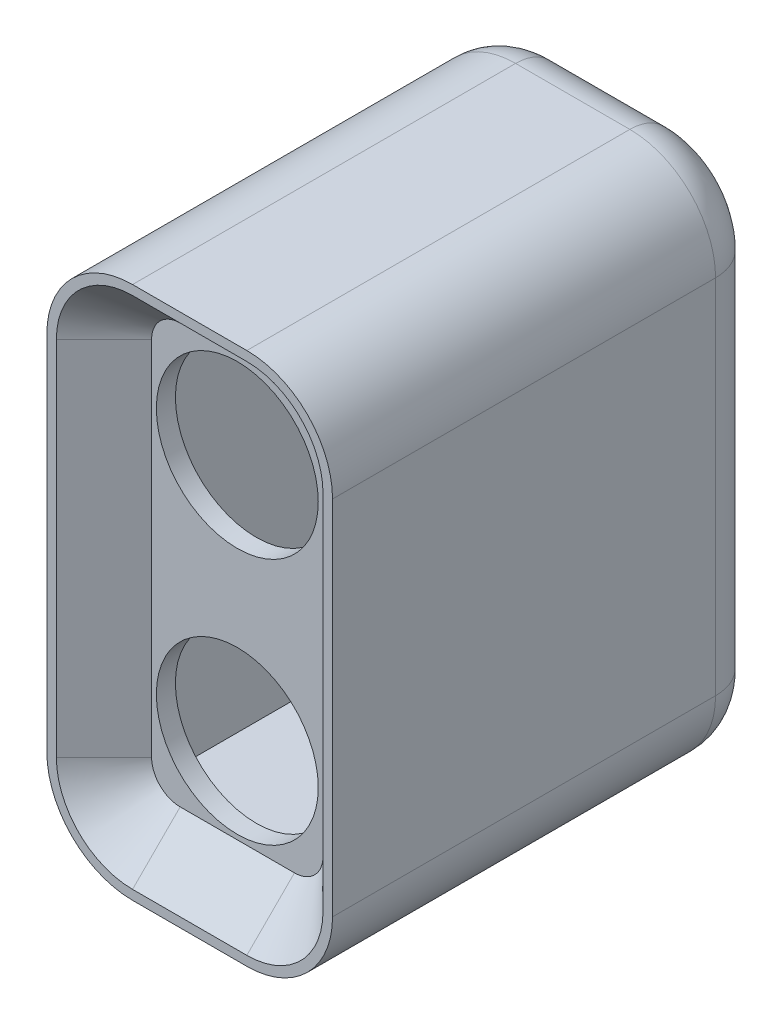
ISO-10303-21;
HEADER;
FILE_DESCRIPTION(('STEP AP214'),'2;1');
FILE_NAME('part.step','',(''),(''),'','','');
FILE_SCHEMA(('AUTOMOTIVE_DESIGN { 1 0 10303 214 1 1 1 1 }'));
ENDSEC;
DATA;
#1=APPLICATION_CONTEXT('core data for automotive mechanical design processes');
#2=APPLICATION_PROTOCOL_DEFINITION('international standard','automotive_design',2000,#1);
#3=PRODUCT_CONTEXT('',#1,'mechanical');
#4=PRODUCT('Part','Part','',(#3));
#5=PRODUCT_RELATED_PRODUCT_CATEGORY('part','',(#4));
#6=PRODUCT_DEFINITION_FORMATION('','',#4);
#7=PRODUCT_DEFINITION_CONTEXT('part definition',#1,'design');
#8=PRODUCT_DEFINITION('design','',#6,#7);
#9=PRODUCT_DEFINITION_SHAPE('','',#8);
#10=(LENGTH_UNIT() NAMED_UNIT(*) SI_UNIT(.MILLI.,.METRE.));
#11=(NAMED_UNIT(*) PLANE_ANGLE_UNIT() SI_UNIT($,.RADIAN.));
#12=(NAMED_UNIT(*) SI_UNIT($,.STERADIAN.) SOLID_ANGLE_UNIT());
#13=UNCERTAINTY_MEASURE_WITH_UNIT(LENGTH_MEASURE(1.E-05),#10,'distance_accuracy_value','');
#14=(GEOMETRIC_REPRESENTATION_CONTEXT(3) GLOBAL_UNCERTAINTY_ASSIGNED_CONTEXT((#13)) GLOBAL_UNIT_ASSIGNED_CONTEXT((#10,
#11,#12)) REPRESENTATION_CONTEXT('',''));
#15=CARTESIAN_POINT('',(0.,0.,0.));
#16=DIRECTION('',(0.,0.,1.));
#17=DIRECTION('',(1.,0.,0.));
#18=AXIS2_PLACEMENT_3D('',#15,#16,#17);
#19=CARTESIAN_POINT('',(12.0414393399998,-9.43999957830333,-103.748520193534));
#20=DIRECTION('',(0.,1.,0.));
#21=DIRECTION('',(-1.,0.,0.));
#22=AXIS2_PLACEMENT_3D('',#19,#20,#21);
#23=PLANE('',#22);
#24=DIRECTION('',(0.,0.,1.));
#25=VECTOR('',#24,1.);
#26=CARTESIAN_POINT('',(12.0414393399998,-9.43999957830333,-103.748520193534));
#27=LINE('',#26,#25);
#28=CARTESIAN_POINT('',(12.0414393399998,-9.43999957830333,-37.61899949646));
#29=VERTEX_POINT('',#28);
#30=CARTESIAN_POINT('',(12.0414393399998,-9.43999957830333,-2.));
#31=VERTEX_POINT('',#30);
#32=EDGE_CURVE('E291',#29,#31,#27,.T.);
#33=ORIENTED_EDGE('',*,*,#32,.F.);
#34=DIRECTION('',(-1.,0.,0.));
#35=VECTOR('',#34,1.);
#36=CARTESIAN_POINT('',(12.0414393399998,-9.43999957830333,-37.61899949646));
#37=LINE('',#36,#35);
#38=CARTESIAN_POINT('',(-10.35,-9.43999957830332,-37.61899949646));
#39=VERTEX_POINT('',#38);
#40=EDGE_CURVE('E274',#29,#39,#37,.T.);
#41=ORIENTED_EDGE('',*,*,#40,.T.);
#42=DIRECTION('',(0.,0.,1.));
#43=VECTOR('',#42,1.);
#44=CARTESIAN_POINT('',(-10.35,-9.43999957830332,-103.748520193534));
#45=LINE('',#44,#43);
#46=CARTESIAN_POINT('',(-10.35,-9.43999957830333,-2.));
#47=VERTEX_POINT('',#46);
#48=EDGE_CURVE('E289',#39,#47,#45,.T.);
#49=ORIENTED_EDGE('',*,*,#48,.T.);
#50=DIRECTION('',(-1.,0.,0.));
#51=VECTOR('',#50,1.);
#52=CARTESIAN_POINT('',(12.0414393399998,-9.43999957830333,-2.));
#53=LINE('',#52,#51);
#54=EDGE_CURVE('E286',#31,#47,#53,.T.);
#55=ORIENTED_EDGE('',*,*,#54,.F.);
#56=EDGE_LOOP('',(#33,#41,#49,#55));
#57=FACE_BOUND('',#56,.T.);
#58=ADVANCED_FACE('F39',(#57),#23,.T.);
#59=CARTESIAN_POINT('',(12.0414393399998,35.76,-103.748520193534));
#60=DIRECTION('',(-1.,0.,0.));
#61=DIRECTION('',(0.,0.,1.));
#62=AXIS2_PLACEMENT_3D('',#59,#60,#61);
#63=PLANE('',#62);
#64=DIRECTION('',(0.,0.,1.));
#65=VECTOR('',#64,1.);
#66=CARTESIAN_POINT('',(12.0414393399998,35.76,-103.748520193534));
#67=LINE('',#66,#65);
#68=CARTESIAN_POINT('',(12.0414393399998,35.76,-37.61899949646));
#69=VERTEX_POINT('',#68);
#70=CARTESIAN_POINT('',(12.0414393399998,35.76,-2.));
#71=VERTEX_POINT('',#70);
#72=EDGE_CURVE('E293',#69,#71,#67,.T.);
#73=ORIENTED_EDGE('',*,*,#72,.F.);
#74=DIRECTION('',(0.,-1.,0.));
#75=VECTOR('',#74,1.);
#76=CARTESIAN_POINT('',(12.0414393399998,35.76,-37.61899949646));
#77=LINE('',#76,#75);
#78=EDGE_CURVE('E271',#69,#29,#77,.T.);
#79=ORIENTED_EDGE('',*,*,#78,.T.);
#80=ORIENTED_EDGE('',*,*,#32,.T.);
#81=DIRECTION('',(0.,-1.,0.));
#82=VECTOR('',#81,1.);
#83=CARTESIAN_POINT('',(12.0414393399998,35.76,-2.));
#84=LINE('',#83,#82);
#85=EDGE_CURVE('E283',#71,#31,#84,.T.);
#86=ORIENTED_EDGE('',*,*,#85,.F.);
#87=EDGE_LOOP('',(#73,#79,#80,#86));
#88=FACE_BOUND('',#87,.T.);
#89=ADVANCED_FACE('F528',(#88),#63,.T.);
#90=CARTESIAN_POINT('',(12.0414393399998,35.76,-103.748520193534));
#91=DIRECTION('',(0.,-1.,0.));
#92=DIRECTION('',(1.,0.,0.));
#93=AXIS2_PLACEMENT_3D('',#90,#91,#92);
#94=PLANE('',#93);
#95=DIRECTION('',(0.,0.,1.));
#96=VECTOR('',#95,1.);
#97=CARTESIAN_POINT('',(-10.35,35.76,-103.748520193534));
#98=LINE('',#97,#96);
#99=CARTESIAN_POINT('',(-10.35,35.76,-37.61899949646));
#100=VERTEX_POINT('',#99);
#101=CARTESIAN_POINT('',(-10.35,35.76,-2.));
#102=VERTEX_POINT('',#101);
#103=EDGE_CURVE('E295',#100,#102,#98,.T.);
#104=ORIENTED_EDGE('',*,*,#103,.F.);
#105=DIRECTION('',(1.,0.,0.));
#106=VECTOR('',#105,1.);
#107=CARTESIAN_POINT('',(12.0414393399998,35.76,-37.61899949646));
#108=LINE('',#107,#106);
#109=EDGE_CURVE('E265',#100,#69,#108,.T.);
#110=ORIENTED_EDGE('',*,*,#109,.T.);
#111=ORIENTED_EDGE('',*,*,#72,.T.);
#112=DIRECTION('',(1.,0.,0.));
#113=VECTOR('',#112,1.);
#114=CARTESIAN_POINT('',(12.0414393399998,35.76,-2.));
#115=LINE('',#114,#113);
#116=EDGE_CURVE('E280',#102,#71,#115,.T.);
#117=ORIENTED_EDGE('',*,*,#116,.F.);
#118=EDGE_LOOP('',(#104,#110,#111,#117));
#119=FACE_BOUND('',#118,.T.);
#120=ADVANCED_FACE('F534',(#119),#94,.T.);
#121=CARTESIAN_POINT('',(-10.35,35.76,-103.748520193534));
#122=DIRECTION('',(1.,0.,0.));
#123=DIRECTION('',(0.,0.,-1.));
#124=AXIS2_PLACEMENT_3D('',#121,#122,#123);
#125=PLANE('',#124);
#126=ORIENTED_EDGE('',*,*,#48,.F.);
#127=DIRECTION('',(0.,1.,0.));
#128=VECTOR('',#127,1.);
#129=CARTESIAN_POINT('',(-10.35,35.76,-37.61899949646));
#130=LINE('',#129,#128);
#131=EDGE_CURVE('E384',#39,#100,#130,.T.);
#132=ORIENTED_EDGE('',*,*,#131,.T.);
#133=ORIENTED_EDGE('',*,*,#103,.T.);
#134=DIRECTION('',(0.,1.,0.));
#135=VECTOR('',#134,1.);
#136=CARTESIAN_POINT('',(-10.35,35.76,-2.));
#137=LINE('',#136,#135);
#138=EDGE_CURVE('E277',#47,#102,#137,.T.);
#139=ORIENTED_EDGE('',*,*,#138,.F.);
#140=EDGE_LOOP('',(#126,#132,#133,#139));
#141=FACE_BOUND('',#140,.T.);
#142=ADVANCED_FACE('F543',(#141),#125,.T.);
#143=CARTESIAN_POINT('',(0.,0.,0.));
#144=DIRECTION('',(0.,0.,1.));
#145=DIRECTION('',(1.,0.,0.));
#146=AXIS2_PLACEMENT_3D('',#143,#144,#145);
#147=PLANE('',#146);
#148=CARTESIAN_POINT('',(1.27555911146049E-06,0.160000210848315,0.));
#149=DIRECTION('',(0.,0.,1.));
#150=DIRECTION('',(1.,0.,0.));
#151=AXIS2_PLACEMENT_3D('',#148,#149,#150);
#152=CIRCLE('',#151,8.5);
#153=CARTESIAN_POINT('',(8.50000127555911,0.160000210848315,0.));
#154=VERTEX_POINT('',#153);
#155=EDGE_CURVE('E324',#154,#154,#152,.T.);
#156=ORIENTED_EDGE('',*,*,#155,.F.);
#157=EDGE_LOOP('',(#156));
#158=FACE_BOUND('',#157,.T.);
#159=CARTESIAN_POINT('',(1.27555911146049E-06,26.1600002108483,0.));
#160=DIRECTION('',(0.,0.,1.));
#161=DIRECTION('',(1.,0.,0.));
#162=AXIS2_PLACEMENT_3D('',#159,#160,#161);
#163=CIRCLE('',#162,8.5);
#164=CARTESIAN_POINT('',(8.50000127555911,26.1600002108483,0.));
#165=VERTEX_POINT('',#164);
#166=EDGE_CURVE('E319',#165,#165,#163,.T.);
#167=ORIENTED_EDGE('',*,*,#166,.F.);
#168=EDGE_LOOP('',(#167));
#169=FACE_BOUND('',#168,.T.);
#170=DIRECTION('',(0.,1.,0.));
#171=VECTOR('',#170,1.);
#172=CARTESIAN_POINT('',(9.00000127555903,-8.83999978915169,0.));
#173=LINE('',#172,#171);
#174=CARTESIAN_POINT('',(9.00000127555903,-5.83999978915169,0.));
#175=VERTEX_POINT('',#174);
#176=CARTESIAN_POINT('',(9.00000127555903,32.1600002108483,0.));
#177=VERTEX_POINT('',#176);
#178=EDGE_CURVE('E303',#175,#177,#173,.T.);
#179=ORIENTED_EDGE('',*,*,#178,.T.);
#180=CARTESIAN_POINT('',(6.00000127555903,32.1600002108483,0.));
#181=DIRECTION('',(0.,0.,1.));
#182=DIRECTION('',(1.,0.,0.));
#183=AXIS2_PLACEMENT_3D('',#180,#181,#182);
#184=CIRCLE('',#183,3.);
#185=CARTESIAN_POINT('',(6.00000127555903,35.1600002108483,0.));
#186=VERTEX_POINT('',#185);
#187=EDGE_CURVE('E364',#177,#186,#184,.T.);
#188=ORIENTED_EDGE('',*,*,#187,.T.);
#189=DIRECTION('',(-1.,0.,0.));
#190=VECTOR('',#189,1.);
#191=CARTESIAN_POINT('',(9.00000127555903,35.1600002108483,0.));
#192=LINE('',#191,#190);
#193=CARTESIAN_POINT('',(-5.99999872444088,35.1600002108483,0.));
#194=VERTEX_POINT('',#193);
#195=EDGE_CURVE('E305',#186,#194,#192,.T.);
#196=ORIENTED_EDGE('',*,*,#195,.T.);
#197=CARTESIAN_POINT('',(-5.99999872444088,32.1600002108483,0.));
#198=DIRECTION('',(0.,0.,1.));
#199=DIRECTION('',(1.,0.,0.));
#200=AXIS2_PLACEMENT_3D('',#197,#198,#199);
#201=CIRCLE('',#200,3.);
#202=CARTESIAN_POINT('',(-8.99999872444088,32.1600002108483,0.));
#203=VERTEX_POINT('',#202);
#204=EDGE_CURVE('E362',#194,#203,#201,.T.);
#205=ORIENTED_EDGE('',*,*,#204,.T.);
#206=DIRECTION('',(0.,-1.,0.));
#207=VECTOR('',#206,1.);
#208=CARTESIAN_POINT('',(-8.99999872444088,-8.83999978915169,0.));
#209=LINE('',#208,#207);
#210=CARTESIAN_POINT('',(-8.99999872444088,-5.83999978915169,0.));
#211=VERTEX_POINT('',#210);
#212=EDGE_CURVE('E298',#203,#211,#209,.T.);
#213=ORIENTED_EDGE('',*,*,#212,.T.);
#214=CARTESIAN_POINT('',(-5.99999872444088,-5.83999978915169,0.));
#215=DIRECTION('',(0.,0.,1.));
#216=DIRECTION('',(1.,0.,0.));
#217=AXIS2_PLACEMENT_3D('',#214,#215,#216);
#218=CIRCLE('',#217,3.);
#219=CARTESIAN_POINT('',(-5.99999872444088,-8.83999978915169,0.));
#220=VERTEX_POINT('',#219);
#221=EDGE_CURVE('E358',#211,#220,#218,.T.);
#222=ORIENTED_EDGE('',*,*,#221,.T.);
#223=DIRECTION('',(1.,0.,0.));
#224=VECTOR('',#223,1.);
#225=CARTESIAN_POINT('',(9.00000127555903,-8.83999978915169,0.));
#226=LINE('',#225,#224);
#227=CARTESIAN_POINT('',(6.00000127555903,-8.83999978915169,0.));
#228=VERTEX_POINT('',#227);
#229=EDGE_CURVE('E300',#220,#228,#226,.T.);
#230=ORIENTED_EDGE('',*,*,#229,.T.);
#231=CARTESIAN_POINT('',(6.00000127555903,-5.83999978915169,0.));
#232=DIRECTION('',(0.,0.,1.));
#233=DIRECTION('',(1.,0.,0.));
#234=AXIS2_PLACEMENT_3D('',#231,#232,#233);
#235=CIRCLE('',#234,3.);
#236=EDGE_CURVE('E360',#228,#175,#235,.T.);
#237=ORIENTED_EDGE('',*,*,#236,.T.);
#238=EDGE_LOOP('',(#179,#188,#196,#205,#213,#222,#230,#237));
#239=FACE_BOUND('',#238,.T.);
#240=ADVANCED_FACE('F547',(#158,#169,#239),#147,.T.);
#241=CARTESIAN_POINT('',(0.,-14.8399997891517,-2.));
#242=DIRECTION('',(0.,-1.,0.));
#243=DIRECTION('',(0.,0.,-1.));
#244=AXIS2_PLACEMENT_3D('',#241,#242,#243);
#245=PLANE('',#244);
#246=DIRECTION('',(0.,0.,1.));
#247=VECTOR('',#246,1.);
#248=CARTESIAN_POINT('',(-5.99999872444086,-14.8399997891517,-2.));
#249=LINE('',#248,#247);
#250=CARTESIAN_POINT('',(-5.99999872444086,-14.8399997891517,5.));
#251=VERTEX_POINT('',#250);
#252=CARTESIAN_POINT('',(-5.99999872444086,-14.8399997891517,-35.21899949646));
#253=VERTEX_POINT('',#252);
#254=EDGE_CURVE('E348',#251,#253,#249,.F.);
#255=ORIENTED_EDGE('',*,*,#254,.T.);
#256=DIRECTION('',(-1.,0.,0.));
#257=VECTOR('',#256,1.);
#258=CARTESIAN_POINT('',(0.,-14.8399997891517,-35.21899949646));
#259=LINE('',#258,#257);
#260=CARTESIAN_POINT('',(6.00000127555909,-14.8399997891517,-35.21899949646));
#261=VERTEX_POINT('',#260);
#262=EDGE_CURVE('E429',#253,#261,#259,.F.);
#263=ORIENTED_EDGE('',*,*,#262,.T.);
#264=DIRECTION('',(0.,0.,1.));
#265=VECTOR('',#264,1.);
#266=CARTESIAN_POINT('',(6.00000127555909,-14.8399997891517,-2.));
#267=LINE('',#266,#265);
#268=CARTESIAN_POINT('',(6.00000127555909,-14.8399997891517,5.));
#269=VERTEX_POINT('',#268);
#270=EDGE_CURVE('E351',#261,#269,#267,.T.);
#271=ORIENTED_EDGE('',*,*,#270,.T.);
#272=DIRECTION('',(1.,0.,0.));
#273=VECTOR('',#272,1.);
#274=CARTESIAN_POINT('',(-14.9999987244409,-14.8399997891517,5.));
#275=LINE('',#274,#273);
#276=EDGE_CURVE('E310',#251,#269,#275,.T.);
#277=ORIENTED_EDGE('',*,*,#276,.F.);
#278=EDGE_LOOP('',(#255,#263,#271,#277));
#279=FACE_BOUND('',#278,.T.);
#280=ADVANCED_FACE('F482',(#279),#245,.T.);
#281=CARTESIAN_POINT('',(-14.9999987244409,0.,-2.));
#282=DIRECTION('',(1.,0.,0.));
#283=DIRECTION('',(0.,1.,0.));
#284=AXIS2_PLACEMENT_3D('',#281,#282,#283);
#285=PLANE('',#284);
#286=DIRECTION('',(0.,0.,1.));
#287=VECTOR('',#286,1.);
#288=CARTESIAN_POINT('',(-14.9999987244408,32.1600002108483,-2.));
#289=LINE('',#288,#287);
#290=CARTESIAN_POINT('',(-14.9999987244408,32.1600002108483,5.));
#291=VERTEX_POINT('',#290);
#292=CARTESIAN_POINT('',(-14.9999987244408,32.1600002108483,-35.21899949646));
#293=VERTEX_POINT('',#292);
#294=EDGE_CURVE('E355',#291,#293,#289,.F.);
#295=ORIENTED_EDGE('',*,*,#294,.T.);
#296=DIRECTION('',(0.,1.,0.));
#297=VECTOR('',#296,1.);
#298=CARTESIAN_POINT('',(-14.9999987244409,-5.83999978915168,-35.21899949646));
#299=LINE('',#298,#297);
#300=CARTESIAN_POINT('',(-14.9999987244409,-5.83999978915167,-35.21899949646));
#301=VERTEX_POINT('',#300);
#302=EDGE_CURVE('E424',#293,#301,#299,.F.);
#303=ORIENTED_EDGE('',*,*,#302,.T.);
#304=DIRECTION('',(0.,0.,1.));
#305=VECTOR('',#304,1.);
#306=CARTESIAN_POINT('',(-14.9999987244409,-5.83999978915167,5.));
#307=LINE('',#306,#305);
#308=CARTESIAN_POINT('',(-14.9999987244409,-5.83999978915167,5.));
#309=VERTEX_POINT('',#308);
#310=EDGE_CURVE('E353',#301,#309,#307,.T.);
#311=ORIENTED_EDGE('',*,*,#310,.T.);
#312=DIRECTION('',(0.,-1.,0.));
#313=VECTOR('',#312,1.);
#314=CARTESIAN_POINT('',(-14.9999987244408,41.1600002108483,5.));
#315=LINE('',#314,#313);
#316=EDGE_CURVE('E307',#291,#309,#315,.T.);
#317=ORIENTED_EDGE('',*,*,#316,.F.);
#318=EDGE_LOOP('',(#295,#303,#311,#317));
#319=FACE_BOUND('',#318,.T.);
#320=ADVANCED_FACE('F516',(#319),#285,.F.);
#321=CARTESIAN_POINT('',(0.,41.1600002108483,-2.));
#322=DIRECTION('',(0.,-1.,0.));
#323=DIRECTION('',(0.,0.,-1.));
#324=AXIS2_PLACEMENT_3D('',#321,#322,#323);
#325=PLANE('',#324);
#326=DIRECTION('',(0.,0.,1.));
#327=VECTOR('',#326,1.);
#328=CARTESIAN_POINT('',(6.00000127555904,41.1600002108483,-2.));
#329=LINE('',#328,#327);
#330=CARTESIAN_POINT('',(6.00000127555904,41.1600002108483,5.));
#331=VERTEX_POINT('',#330);
#332=CARTESIAN_POINT('',(6.00000127555904,41.1600002108483,-35.21899949646));
#333=VERTEX_POINT('',#332);
#334=EDGE_CURVE('E346',#331,#333,#329,.F.);
#335=ORIENTED_EDGE('',*,*,#334,.T.);
#336=DIRECTION('',(1.,0.,0.));
#337=VECTOR('',#336,1.);
#338=CARTESIAN_POINT('',(-5.99999872444082,41.1600002108483,-35.21899949646));
#339=LINE('',#338,#337);
#340=CARTESIAN_POINT('',(-5.99999872444081,41.1600002108483,-35.21899949646));
#341=VERTEX_POINT('',#340);
#342=EDGE_CURVE('E48',#333,#341,#339,.F.);
#343=ORIENTED_EDGE('',*,*,#342,.T.);
#344=DIRECTION('',(0.,0.,1.));
#345=VECTOR('',#344,1.);
#346=CARTESIAN_POINT('',(-5.99999872444081,41.1600002108483,-2.));
#347=LINE('',#346,#345);
#348=CARTESIAN_POINT('',(-5.99999872444082,41.1600002108483,5.));
#349=VERTEX_POINT('',#348);
#350=EDGE_CURVE('E344',#341,#349,#347,.T.);
#351=ORIENTED_EDGE('',*,*,#350,.T.);
#352=DIRECTION('',(-1.,0.,0.));
#353=VECTOR('',#352,1.);
#354=CARTESIAN_POINT('',(15.000001275559,41.1600002108483,5.));
#355=LINE('',#354,#353);
#356=EDGE_CURVE('E316',#331,#349,#355,.T.);
#357=ORIENTED_EDGE('',*,*,#356,.F.);
#358=EDGE_LOOP('',(#335,#343,#351,#357));
#359=FACE_BOUND('',#358,.T.);
#360=ADVANCED_FACE('F561',(#359),#325,.F.);
#361=CARTESIAN_POINT('',(1.27555911146049E-06,0.160000210848315,-2.));
#362=DIRECTION('',(0.,0.,1.));
#363=DIRECTION('',(1.,0.,0.));
#364=AXIS2_PLACEMENT_3D('',#361,#362,#363);
#365=CYLINDRICAL_SURFACE('',#364,8.5);
#366=CARTESIAN_POINT('',(1.27555911146049E-06,0.160000210848315,-2.));
#367=DIRECTION('',(0.,0.,1.));
#368=DIRECTION('',(1.,0.,0.));
#369=AXIS2_PLACEMENT_3D('',#366,#367,#368);
#370=CIRCLE('',#369,8.5);
#371=CARTESIAN_POINT('',(8.50000127555911,0.160000210848315,-2.));
#372=VERTEX_POINT('',#371);
#373=EDGE_CURVE('E323',#372,#372,#370,.T.);
#374=ORIENTED_EDGE('',*,*,#373,.F.);
#375=EDGE_LOOP('',(#374));
#376=FACE_BOUND('',#375,.T.);
#377=ORIENTED_EDGE('',*,*,#155,.T.);
#378=EDGE_LOOP('',(#377));
#379=FACE_BOUND('',#378,.T.);
#380=ADVANCED_FACE('F564',(#376,#379),#365,.F.);
#381=CARTESIAN_POINT('',(1.27555911146049E-06,26.1600002108483,-2.));
#382=DIRECTION('',(0.,0.,1.));
#383=DIRECTION('',(1.,0.,0.));
#384=AXIS2_PLACEMENT_3D('',#381,#382,#383);
#385=CYLINDRICAL_SURFACE('',#384,8.5);
#386=CARTESIAN_POINT('',(1.27555911146049E-06,26.1600002108483,-2.));
#387=DIRECTION('',(0.,0.,1.));
#388=DIRECTION('',(1.,0.,0.));
#389=AXIS2_PLACEMENT_3D('',#386,#387,#388);
#390=CIRCLE('',#389,8.5);
#391=CARTESIAN_POINT('',(8.50000127555911,26.1600002108483,-2.));
#392=VERTEX_POINT('',#391);
#393=EDGE_CURVE('E320',#392,#392,#390,.T.);
#394=ORIENTED_EDGE('',*,*,#393,.F.);
#395=EDGE_LOOP('',(#394));
#396=FACE_BOUND('',#395,.T.);
#397=ORIENTED_EDGE('',*,*,#166,.T.);
#398=EDGE_LOOP('',(#397));
#399=FACE_BOUND('',#398,.T.);
#400=ADVANCED_FACE('F567',(#396,#399),#385,.F.);
#401=CARTESIAN_POINT('',(15.0000012755591,0.,-2.));
#402=DIRECTION('',(1.,0.,0.));
#403=DIRECTION('',(0.,1.,0.));
#404=AXIS2_PLACEMENT_3D('',#401,#402,#403);
#405=PLANE('',#404);
#406=DIRECTION('',(0.,0.,1.));
#407=VECTOR('',#406,1.);
#408=CARTESIAN_POINT('',(15.0000012755591,-5.83999978915167,-2.));
#409=LINE('',#408,#407);
#410=CARTESIAN_POINT('',(15.0000012755591,-5.83999978915167,5.));
#411=VERTEX_POINT('',#410);
#412=CARTESIAN_POINT('',(15.0000012755591,-5.83999978915167,-35.21899949646));
#413=VERTEX_POINT('',#412);
#414=EDGE_CURVE('E327',#411,#413,#409,.F.);
#415=ORIENTED_EDGE('',*,*,#414,.T.);
#416=DIRECTION('',(0.,-1.,0.));
#417=VECTOR('',#416,1.);
#418=CARTESIAN_POINT('',(15.0000012755591,0.,-35.21899949646));
#419=LINE('',#418,#417);
#420=CARTESIAN_POINT('',(15.000001275559,32.1600002108483,-35.21899949646));
#421=VERTEX_POINT('',#420);
#422=EDGE_CURVE('E433',#413,#421,#419,.F.);
#423=ORIENTED_EDGE('',*,*,#422,.T.);
#424=DIRECTION('',(0.,0.,1.));
#425=VECTOR('',#424,1.);
#426=CARTESIAN_POINT('',(15.000001275559,32.1600002108483,5.));
#427=LINE('',#426,#425);
#428=CARTESIAN_POINT('',(15.000001275559,32.1600002108483,5.));
#429=VERTEX_POINT('',#428);
#430=EDGE_CURVE('E334',#421,#429,#427,.T.);
#431=ORIENTED_EDGE('',*,*,#430,.T.);
#432=DIRECTION('',(0.,1.,0.));
#433=VECTOR('',#432,1.);
#434=CARTESIAN_POINT('',(15.0000012755591,-14.8399997891517,5.));
#435=LINE('',#434,#433);
#436=EDGE_CURVE('E313',#411,#429,#435,.T.);
#437=ORIENTED_EDGE('',*,*,#436,.F.);
#438=EDGE_LOOP('',(#415,#423,#431,#437));
#439=FACE_BOUND('',#438,.T.);
#440=ADVANCED_FACE('F468',(#439),#405,.T.);
#441=CARTESIAN_POINT('',(0.,0.,-2.));
#442=DIRECTION('',(0.,0.,1.));
#443=DIRECTION('',(1.,0.,0.));
#444=AXIS2_PLACEMENT_3D('',#441,#442,#443);
#445=PLANE('',#444);
#446=ORIENTED_EDGE('',*,*,#54,.T.);
#447=ORIENTED_EDGE('',*,*,#138,.T.);
#448=ORIENTED_EDGE('',*,*,#116,.T.);
#449=ORIENTED_EDGE('',*,*,#85,.T.);
#450=EDGE_LOOP('',(#446,#447,#448,#449));
#451=FACE_BOUND('',#450,.T.);
#452=ORIENTED_EDGE('',*,*,#393,.T.);
#453=EDGE_LOOP('',(#452));
#454=FACE_BOUND('',#453,.T.);
#455=ORIENTED_EDGE('',*,*,#373,.T.);
#456=EDGE_LOOP('',(#455));
#457=FACE_BOUND('',#456,.T.);
#458=ADVANCED_FACE('F551',(#451,#454,#457),#445,.F.);
#459=CARTESIAN_POINT('',(0.,0.,5.));
#460=DIRECTION('',(0.,0.,1.));
#461=DIRECTION('',(1.,0.,0.));
#462=AXIS2_PLACEMENT_3D('',#459,#460,#461);
#463=PLANE('',#462);
#464=DIRECTION('',(1.,0.,0.));
#465=VECTOR('',#464,1.);
#466=CARTESIAN_POINT('',(0.,40.1600002108483,5.));
#467=LINE('',#466,#465);
#468=CARTESIAN_POINT('',(-5.99999872444088,40.1600002108483,5.));
#469=VERTEX_POINT('',#468);
#470=CARTESIAN_POINT('',(6.00000127555904,40.1600002108483,5.));
#471=VERTEX_POINT('',#470);
#472=EDGE_CURVE('E377',#469,#471,#467,.T.);
#473=ORIENTED_EDGE('',*,*,#472,.T.);
#474=CARTESIAN_POINT('',(6.00000127555903,32.1600002108483,5.));
#475=DIRECTION('',(0.,0.,1.));
#476=DIRECTION('',(1.,0.,0.));
#477=AXIS2_PLACEMENT_3D('',#474,#475,#476);
#478=CIRCLE('',#477,8.00000000000003);
#479=CARTESIAN_POINT('',(14.0000012755591,32.1600002108483,5.));
#480=VERTEX_POINT('',#479);
#481=EDGE_CURVE('E381',#471,#480,#478,.F.);
#482=ORIENTED_EDGE('',*,*,#481,.T.);
#483=DIRECTION('',(0.,-1.,0.));
#484=VECTOR('',#483,1.);
#485=CARTESIAN_POINT('',(14.0000012755591,0.,5.));
#486=LINE('',#485,#484);
#487=CARTESIAN_POINT('',(14.0000012755591,-5.83999978915169,5.));
#488=VERTEX_POINT('',#487);
#489=EDGE_CURVE('E379',#480,#488,#486,.T.);
#490=ORIENTED_EDGE('',*,*,#489,.T.);
#491=CARTESIAN_POINT('',(6.00000127555903,-5.83999978915169,5.));
#492=DIRECTION('',(0.,0.,1.));
#493=DIRECTION('',(1.,0.,0.));
#494=AXIS2_PLACEMENT_3D('',#491,#492,#493);
#495=CIRCLE('',#494,8.00000000000003);
#496=CARTESIAN_POINT('',(6.00000127555903,-13.8399997891517,5.));
#497=VERTEX_POINT('',#496);
#498=EDGE_CURVE('E375',#488,#497,#495,.F.);
#499=ORIENTED_EDGE('',*,*,#498,.T.);
#500=DIRECTION('',(-1.,0.,0.));
#501=VECTOR('',#500,1.);
#502=CARTESIAN_POINT('',(0.,-13.8399997891517,5.));
#503=LINE('',#502,#501);
#504=CARTESIAN_POINT('',(-5.99999872444088,-13.8399997891517,5.));
#505=VERTEX_POINT('',#504);
#506=EDGE_CURVE('E371',#497,#505,#503,.T.);
#507=ORIENTED_EDGE('',*,*,#506,.T.);
#508=CARTESIAN_POINT('',(-5.99999872444088,-5.83999978915169,5.));
#509=DIRECTION('',(0.,0.,1.));
#510=DIRECTION('',(1.,0.,0.));
#511=AXIS2_PLACEMENT_3D('',#508,#509,#510);
#512=CIRCLE('',#511,8.00000000000003);
#513=CARTESIAN_POINT('',(-13.9999987244409,-5.83999978915169,5.));
#514=VERTEX_POINT('',#513);
#515=EDGE_CURVE('E367',#505,#514,#512,.F.);
#516=ORIENTED_EDGE('',*,*,#515,.T.);
#517=DIRECTION('',(0.,1.,0.));
#518=VECTOR('',#517,1.);
#519=CARTESIAN_POINT('',(-13.9999987244409,0.,5.));
#520=LINE('',#519,#518);
#521=CARTESIAN_POINT('',(-13.9999987244409,32.1600002108483,5.));
#522=VERTEX_POINT('',#521);
#523=EDGE_CURVE('E369',#514,#522,#520,.T.);
#524=ORIENTED_EDGE('',*,*,#523,.T.);
#525=CARTESIAN_POINT('',(-5.99999872444088,32.1600002108483,5.));
#526=DIRECTION('',(0.,0.,1.));
#527=DIRECTION('',(1.,0.,0.));
#528=AXIS2_PLACEMENT_3D('',#525,#526,#527);
#529=CIRCLE('',#528,8.00000000000003);
#530=EDGE_CURVE('E373',#522,#469,#529,.F.);
#531=ORIENTED_EDGE('',*,*,#530,.T.);
#532=EDGE_LOOP('',(#473,#482,#490,#499,#507,#516,#524,#531));
#533=FACE_BOUND('',#532,.T.);
#534=ORIENTED_EDGE('',*,*,#436,.T.);
#535=CARTESIAN_POINT('',(6.00000127555904,32.1600002108483,5.));
#536=DIRECTION('',(0.,0.,1.));
#537=DIRECTION('',(1.,0.,0.));
#538=AXIS2_PLACEMENT_3D('',#535,#536,#537);
#539=CIRCLE('',#538,9.);
#540=EDGE_CURVE('E342',#429,#331,#539,.T.);
#541=ORIENTED_EDGE('',*,*,#540,.T.);
#542=ORIENTED_EDGE('',*,*,#356,.T.);
#543=CARTESIAN_POINT('',(-5.99999872444081,32.1600002108483,5.));
#544=DIRECTION('',(0.,0.,1.));
#545=DIRECTION('',(1.,0.,0.));
#546=AXIS2_PLACEMENT_3D('',#543,#544,#545);
#547=CIRCLE('',#546,9.);
#548=EDGE_CURVE('E338',#349,#291,#547,.T.);
#549=ORIENTED_EDGE('',*,*,#548,.T.);
#550=ORIENTED_EDGE('',*,*,#316,.T.);
#551=CARTESIAN_POINT('',(-5.99999872444086,-5.83999978915168,5.));
#552=DIRECTION('',(0.,0.,1.));
#553=DIRECTION('',(1.,0.,0.));
#554=AXIS2_PLACEMENT_3D('',#551,#552,#553);
#555=CIRCLE('',#554,9.);
#556=EDGE_CURVE('E336',#309,#251,#555,.T.);
#557=ORIENTED_EDGE('',*,*,#556,.T.);
#558=ORIENTED_EDGE('',*,*,#276,.T.);
#559=CARTESIAN_POINT('',(6.00000127555909,-5.83999978915168,5.));
#560=DIRECTION('',(0.,0.,1.));
#561=DIRECTION('',(1.,0.,0.));
#562=AXIS2_PLACEMENT_3D('',#559,#560,#561);
#563=CIRCLE('',#562,9.);
#564=EDGE_CURVE('E340',#269,#411,#563,.T.);
#565=ORIENTED_EDGE('',*,*,#564,.T.);
#566=EDGE_LOOP('',(#534,#541,#542,#549,#550,#557,#558,#565));
#567=FACE_BOUND('',#566,.T.);
#568=ADVANCED_FACE('F475',(#533,#567),#463,.T.);
#569=CARTESIAN_POINT('',(6.00000127555904,32.1600002108483,-2.));
#570=DIRECTION('',(0.,0.,-1.));
#571=DIRECTION('',(-1.,0.,0.));
#572=AXIS2_PLACEMENT_3D('',#569,#570,#571);
#573=CYLINDRICAL_SURFACE('',#572,9.);
#574=ORIENTED_EDGE('',*,*,#430,.F.);
#575=CARTESIAN_POINT('',(6.00000127555904,32.1600002108483,-35.21899949646));
#576=DIRECTION('',(0.,0.,-1.));
#577=DIRECTION('',(-1.,0.,0.));
#578=AXIS2_PLACEMENT_3D('',#575,#576,#577);
#579=CIRCLE('',#578,9.);
#580=EDGE_CURVE('E63',#421,#333,#579,.F.);
#581=ORIENTED_EDGE('',*,*,#580,.T.);
#582=ORIENTED_EDGE('',*,*,#334,.F.);
#583=ORIENTED_EDGE('',*,*,#540,.F.);
#584=EDGE_LOOP('',(#574,#581,#582,#583));
#585=FACE_BOUND('',#584,.T.);
#586=ADVANCED_FACE('F472',(#585),#573,.T.);
#587=CARTESIAN_POINT('',(6.00000127555909,-5.83999978915168,-2.));
#588=DIRECTION('',(0.,0.,1.));
#589=DIRECTION('',(1.,0.,0.));
#590=AXIS2_PLACEMENT_3D('',#587,#588,#589);
#591=CYLINDRICAL_SURFACE('',#590,9.);
#592=ORIENTED_EDGE('',*,*,#270,.F.);
#593=CARTESIAN_POINT('',(6.00000127555909,-5.83999978915168,-35.21899949646));
#594=DIRECTION('',(0.,0.,-1.));
#595=DIRECTION('',(-1.,0.,0.));
#596=AXIS2_PLACEMENT_3D('',#593,#594,#595);
#597=CIRCLE('',#596,9.);
#598=EDGE_CURVE('E431',#261,#413,#597,.F.);
#599=ORIENTED_EDGE('',*,*,#598,.T.);
#600=ORIENTED_EDGE('',*,*,#414,.F.);
#601=ORIENTED_EDGE('',*,*,#564,.F.);
#602=EDGE_LOOP('',(#592,#599,#600,#601));
#603=FACE_BOUND('',#602,.T.);
#604=ADVANCED_FACE('F479',(#603),#591,.T.);
#605=CARTESIAN_POINT('',(-5.99999872444081,32.1600002108483,-2.));
#606=DIRECTION('',(0.,0.,1.));
#607=DIRECTION('',(1.,0.,0.));
#608=AXIS2_PLACEMENT_3D('',#605,#606,#607);
#609=CYLINDRICAL_SURFACE('',#608,9.);
#610=ORIENTED_EDGE('',*,*,#350,.F.);
#611=CARTESIAN_POINT('',(-5.99999872444081,32.1600002108483,-35.21899949646));
#612=DIRECTION('',(0.,0.,-1.));
#613=DIRECTION('',(-1.,0.,0.));
#614=AXIS2_PLACEMENT_3D('',#611,#612,#613);
#615=CIRCLE('',#614,9.);
#616=EDGE_CURVE('E11',#341,#293,#615,.F.);
#617=ORIENTED_EDGE('',*,*,#616,.T.);
#618=ORIENTED_EDGE('',*,*,#294,.F.);
#619=ORIENTED_EDGE('',*,*,#548,.F.);
#620=EDGE_LOOP('',(#610,#617,#618,#619));
#621=FACE_BOUND('',#620,.T.);
#622=ADVANCED_FACE('F511',(#621),#609,.T.);
#623=CARTESIAN_POINT('',(-5.99999872444086,-5.83999978915168,-2.));
#624=DIRECTION('',(0.,0.,-1.));
#625=DIRECTION('',(-1.,0.,0.));
#626=AXIS2_PLACEMENT_3D('',#623,#624,#625);
#627=CYLINDRICAL_SURFACE('',#626,9.);
#628=ORIENTED_EDGE('',*,*,#310,.F.);
#629=CARTESIAN_POINT('',(-5.99999872444086,-5.83999978915168,-35.21899949646));
#630=DIRECTION('',(0.,0.,-1.));
#631=DIRECTION('',(-1.,0.,0.));
#632=AXIS2_PLACEMENT_3D('',#629,#630,#631);
#633=CIRCLE('',#632,9.);
#634=EDGE_CURVE('E427',#301,#253,#633,.F.);
#635=ORIENTED_EDGE('',*,*,#634,.T.);
#636=ORIENTED_EDGE('',*,*,#254,.F.);
#637=ORIENTED_EDGE('',*,*,#556,.F.);
#638=EDGE_LOOP('',(#628,#635,#636,#637));
#639=FACE_BOUND('',#638,.T.);
#640=ADVANCED_FACE('F582',(#639),#627,.T.);
#641=CARTESIAN_POINT('',(-5.99999872444088,-5.83999978915169,5.));
#642=DIRECTION('',(0.,0.,1.));
#643=DIRECTION('',(1.,0.,0.));
#644=AXIS2_PLACEMENT_3D('',#641,#642,#643);
#645=CONICAL_SURFACE('',#644,8.00000000000003,0.785398163397448);
#646=DIRECTION('',(0.,-0.707106781186548,0.707106781186548));
#647=VECTOR('',#646,1.);
#648=CARTESIAN_POINT('',(-5.99999872444088,-8.83999978915169,0.));
#649=LINE('',#648,#647);
#650=EDGE_CURVE('E400',#220,#505,#649,.T.);
#651=ORIENTED_EDGE('',*,*,#650,.F.);
#652=ORIENTED_EDGE('',*,*,#221,.F.);
#653=DIRECTION('',(0.707106781186547,0.,-0.707106781186548));
#654=VECTOR('',#653,1.);
#655=CARTESIAN_POINT('',(-13.9999987244409,-5.83999978915169,5.));
#656=LINE('',#655,#654);
#657=EDGE_CURVE('E301',#514,#211,#656,.T.);
#658=ORIENTED_EDGE('',*,*,#657,.F.);
#659=ORIENTED_EDGE('',*,*,#515,.F.);
#660=EDGE_LOOP('',(#651,#652,#658,#659));
#661=FACE_BOUND('',#660,.T.);
#662=ADVANCED_FACE('F585',(#661),#645,.F.);
#663=CARTESIAN_POINT('',(-8.99999872444088,-8.83999978915169,0.));
#664=DIRECTION('',(-0.707106781186548,0.,-0.707106781186547));
#665=DIRECTION('',(0.,-1.,0.));
#666=AXIS2_PLACEMENT_3D('',#663,#664,#665);
#667=PLANE('',#666);
#668=ORIENTED_EDGE('',*,*,#657,.T.);
#669=ORIENTED_EDGE('',*,*,#212,.F.);
#670=DIRECTION('',(0.707106781186547,0.,-0.707106781186548));
#671=VECTOR('',#670,1.);
#672=CARTESIAN_POINT('',(-13.9999987244409,32.1600002108483,5.));
#673=LINE('',#672,#671);
#674=EDGE_CURVE('E397',#522,#203,#673,.T.);
#675=ORIENTED_EDGE('',*,*,#674,.F.);
#676=ORIENTED_EDGE('',*,*,#523,.F.);
#677=EDGE_LOOP('',(#668,#669,#675,#676));
#678=FACE_BOUND('',#677,.T.);
#679=ADVANCED_FACE('F610',(#678),#667,.F.);
#680=CARTESIAN_POINT('',(9.00000127555903,-8.83999978915169,0.));
#681=DIRECTION('',(0.,-0.707106781186548,-0.707106781186548));
#682=DIRECTION('',(1.,0.,0.));
#683=AXIS2_PLACEMENT_3D('',#680,#681,#682);
#684=PLANE('',#683);
#685=ORIENTED_EDGE('',*,*,#650,.T.);
#686=ORIENTED_EDGE('',*,*,#506,.F.);
#687=DIRECTION('',(0.,-0.707106781186548,0.707106781186548));
#688=VECTOR('',#687,1.);
#689=CARTESIAN_POINT('',(6.00000127555903,-8.83999978915169,0.));
#690=LINE('',#689,#688);
#691=EDGE_CURVE('E394',#228,#497,#690,.T.);
#692=ORIENTED_EDGE('',*,*,#691,.F.);
#693=ORIENTED_EDGE('',*,*,#229,.F.);
#694=EDGE_LOOP('',(#685,#686,#692,#693));
#695=FACE_BOUND('',#694,.T.);
#696=ADVANCED_FACE('F606',(#695),#684,.F.);
#697=CARTESIAN_POINT('',(-5.99999872444088,32.1600002108483,5.));
#698=DIRECTION('',(0.,0.,1.));
#699=DIRECTION('',(1.,0.,0.));
#700=AXIS2_PLACEMENT_3D('',#697,#698,#699);
#701=CONICAL_SURFACE('',#700,8.00000000000003,0.785398163397448);
#702=ORIENTED_EDGE('',*,*,#674,.T.);
#703=ORIENTED_EDGE('',*,*,#204,.F.);
#704=DIRECTION('',(0.,-0.707106781186547,-0.707106781186548));
#705=VECTOR('',#704,1.);
#706=CARTESIAN_POINT('',(-5.99999872444088,40.1600002108483,5.));
#707=LINE('',#706,#705);
#708=EDGE_CURVE('E391',#469,#194,#707,.T.);
#709=ORIENTED_EDGE('',*,*,#708,.F.);
#710=ORIENTED_EDGE('',*,*,#530,.F.);
#711=EDGE_LOOP('',(#702,#703,#709,#710));
#712=FACE_BOUND('',#711,.T.);
#713=ADVANCED_FACE('F602',(#712),#701,.F.);
#714=CARTESIAN_POINT('',(6.00000127555903,-5.83999978915169,5.));
#715=DIRECTION('',(0.,0.,1.));
#716=DIRECTION('',(1.,0.,0.));
#717=AXIS2_PLACEMENT_3D('',#714,#715,#716);
#718=CONICAL_SURFACE('',#717,8.00000000000003,0.785398163397448);
#719=ORIENTED_EDGE('',*,*,#691,.T.);
#720=ORIENTED_EDGE('',*,*,#498,.F.);
#721=DIRECTION('',(0.707106781186547,0.,0.707106781186548));
#722=VECTOR('',#721,1.);
#723=CARTESIAN_POINT('',(9.00000127555903,-5.83999978915169,0.));
#724=LINE('',#723,#722);
#725=EDGE_CURVE('E388',#175,#488,#724,.T.);
#726=ORIENTED_EDGE('',*,*,#725,.F.);
#727=ORIENTED_EDGE('',*,*,#236,.F.);
#728=EDGE_LOOP('',(#719,#720,#726,#727));
#729=FACE_BOUND('',#728,.T.);
#730=ADVANCED_FACE('F598',(#729),#718,.F.);
#731=CARTESIAN_POINT('',(9.00000127555903,35.1600002108483,0.));
#732=DIRECTION('',(0.,0.707106781186548,-0.707106781186548));
#733=DIRECTION('',(-1.,0.,0.));
#734=AXIS2_PLACEMENT_3D('',#731,#732,#733);
#735=PLANE('',#734);
#736=ORIENTED_EDGE('',*,*,#708,.T.);
#737=ORIENTED_EDGE('',*,*,#195,.F.);
#738=DIRECTION('',(0.,-0.707106781186548,-0.707106781186547));
#739=VECTOR('',#738,1.);
#740=CARTESIAN_POINT('',(6.00000127555904,40.1600002108483,5.));
#741=LINE('',#740,#739);
#742=EDGE_CURVE('E386',#471,#186,#741,.T.);
#743=ORIENTED_EDGE('',*,*,#742,.F.);
#744=ORIENTED_EDGE('',*,*,#472,.F.);
#745=EDGE_LOOP('',(#736,#737,#743,#744));
#746=FACE_BOUND('',#745,.T.);
#747=ADVANCED_FACE('F594',(#746),#735,.F.);
#748=CARTESIAN_POINT('',(9.00000127555903,-8.83999978915169,0.));
#749=DIRECTION('',(0.707106781186548,0.,-0.707106781186547));
#750=DIRECTION('',(0.,1.,0.));
#751=AXIS2_PLACEMENT_3D('',#748,#749,#750);
#752=PLANE('',#751);
#753=ORIENTED_EDGE('',*,*,#725,.T.);
#754=ORIENTED_EDGE('',*,*,#489,.F.);
#755=DIRECTION('',(0.707106781186547,0.,0.707106781186548));
#756=VECTOR('',#755,1.);
#757=CARTESIAN_POINT('',(9.00000127555903,32.1600002108483,0.));
#758=LINE('',#757,#756);
#759=EDGE_CURVE('E297',#177,#480,#758,.T.);
#760=ORIENTED_EDGE('',*,*,#759,.F.);
#761=ORIENTED_EDGE('',*,*,#178,.F.);
#762=EDGE_LOOP('',(#753,#754,#760,#761));
#763=FACE_BOUND('',#762,.T.);
#764=ADVANCED_FACE('F590',(#763),#752,.F.);
#765=CARTESIAN_POINT('',(6.00000127555903,32.1600002108483,5.));
#766=DIRECTION('',(0.,0.,1.));
#767=DIRECTION('',(1.,0.,0.));
#768=AXIS2_PLACEMENT_3D('',#765,#766,#767);
#769=CONICAL_SURFACE('',#768,8.00000000000003,0.785398163397448);
#770=ORIENTED_EDGE('',*,*,#742,.T.);
#771=ORIENTED_EDGE('',*,*,#187,.F.);
#772=ORIENTED_EDGE('',*,*,#759,.T.);
#773=ORIENTED_EDGE('',*,*,#481,.F.);
#774=EDGE_LOOP('',(#770,#771,#772,#773));
#775=FACE_BOUND('',#774,.T.);
#776=ADVANCED_FACE('F587',(#775),#769,.F.);
#777=CARTESIAN_POINT('',(9.4399999999998,5.41299999999999,-40.21899949646));
#778=DIRECTION('',(0.,0.,-1.));
#779=DIRECTION('',(0.,-1.,0.));
#780=AXIS2_PLACEMENT_3D('',#777,#778,#779);
#781=PLANE('',#780);
#782=CARTESIAN_POINT('',(-5.99999872444086,-5.83999978915168,-40.21899949646));
#783=DIRECTION('',(0.,0.,-1.));
#784=DIRECTION('',(-1.,0.,0.));
#785=AXIS2_PLACEMENT_3D('',#782,#783,#784);
#786=CIRCLE('',#785,4.);
#787=CARTESIAN_POINT('',(-5.99999872444086,-9.83999978915168,-40.21899949646));
#788=VERTEX_POINT('',#787);
#789=CARTESIAN_POINT('',(-9.99999872444086,-5.83999978915168,-40.21899949646));
#790=VERTEX_POINT('',#789);
#791=EDGE_CURVE('E419',#788,#790,#786,.T.);
#792=ORIENTED_EDGE('',*,*,#791,.T.);
#793=DIRECTION('',(0.,1.,0.));
#794=VECTOR('',#793,1.);
#795=CARTESIAN_POINT('',(-9.99999872444081,32.1600002108483,-40.21899949646));
#796=LINE('',#795,#794);
#797=CARTESIAN_POINT('',(-9.99999872444081,32.1600002108483,-40.21899949646));
#798=VERTEX_POINT('',#797);
#799=EDGE_CURVE('E421',#790,#798,#796,.T.);
#800=ORIENTED_EDGE('',*,*,#799,.T.);
#801=CARTESIAN_POINT('',(-5.99999872444081,32.1600002108483,-40.21899949646));
#802=DIRECTION('',(0.,0.,-1.));
#803=DIRECTION('',(-1.,0.,0.));
#804=AXIS2_PLACEMENT_3D('',#801,#802,#803);
#805=CIRCLE('',#804,4.);
#806=CARTESIAN_POINT('',(-5.99999872444081,36.1600002108483,-40.21899949646));
#807=VERTEX_POINT('',#806);
#808=EDGE_CURVE('E407',#798,#807,#805,.T.);
#809=ORIENTED_EDGE('',*,*,#808,.T.);
#810=DIRECTION('',(1.,0.,0.));
#811=VECTOR('',#810,1.);
#812=CARTESIAN_POINT('',(6.00000127555904,36.1600002108483,-40.21899949646));
#813=LINE('',#812,#811);
#814=CARTESIAN_POINT('',(6.00000127555904,36.1600002108483,-40.21899949646));
#815=VERTEX_POINT('',#814);
#816=EDGE_CURVE('E409',#807,#815,#813,.T.);
#817=ORIENTED_EDGE('',*,*,#816,.T.);
#818=CARTESIAN_POINT('',(6.00000127555904,32.1600002108483,-40.21899949646));
#819=DIRECTION('',(0.,0.,-1.));
#820=DIRECTION('',(-1.,0.,0.));
#821=AXIS2_PLACEMENT_3D('',#818,#819,#820);
#822=CIRCLE('',#821,4.);
#823=CARTESIAN_POINT('',(10.000001275559,32.1600002108483,-40.21899949646));
#824=VERTEX_POINT('',#823);
#825=EDGE_CURVE('E411',#815,#824,#822,.T.);
#826=ORIENTED_EDGE('',*,*,#825,.T.);
#827=DIRECTION('',(0.,-1.,0.));
#828=VECTOR('',#827,1.);
#829=CARTESIAN_POINT('',(10.0000012755591,5.41299999999999,-40.21899949646));
#830=LINE('',#829,#828);
#831=CARTESIAN_POINT('',(10.0000012755591,-5.83999978915168,-40.21899949646));
#832=VERTEX_POINT('',#831);
#833=EDGE_CURVE('E413',#824,#832,#830,.T.);
#834=ORIENTED_EDGE('',*,*,#833,.T.);
#835=CARTESIAN_POINT('',(6.00000127555909,-5.83999978915168,-40.21899949646));
#836=DIRECTION('',(0.,0.,-1.));
#837=DIRECTION('',(-1.,0.,0.));
#838=AXIS2_PLACEMENT_3D('',#835,#836,#837);
#839=CIRCLE('',#838,4.);
#840=CARTESIAN_POINT('',(6.00000127555909,-9.83999978915168,-40.21899949646));
#841=VERTEX_POINT('',#840);
#842=EDGE_CURVE('E415',#832,#841,#839,.T.);
#843=ORIENTED_EDGE('',*,*,#842,.T.);
#844=DIRECTION('',(-1.,0.,0.));
#845=VECTOR('',#844,1.);
#846=CARTESIAN_POINT('',(9.4399999999998,-9.83999978915168,-40.21899949646));
#847=LINE('',#846,#845);
#848=EDGE_CURVE('E417',#841,#788,#847,.T.);
#849=ORIENTED_EDGE('',*,*,#848,.T.);
#850=EDGE_LOOP('',(#792,#800,#809,#817,#826,#834,#843,#849));
#851=FACE_BOUND('',#850,.T.);
#852=DIRECTION('',(0.,-1.,0.));
#853=VECTOR('',#852,1.);
#854=CARTESIAN_POINT('',(9.5399999999998,0.,-40.21899949646));
#855=LINE('',#854,#853);
#856=CARTESIAN_POINT('',(9.5399999999998,19.8600004216967,-40.21899949646));
#857=VERTEX_POINT('',#856);
#858=CARTESIAN_POINT('',(9.5399999999998,6.46,-40.21899949646));
#859=VERTEX_POINT('',#858);
#860=EDGE_CURVE('E259',#857,#859,#855,.T.);
#861=ORIENTED_EDGE('',*,*,#860,.F.);
#862=DIRECTION('',(1.,0.,0.));
#863=VECTOR('',#862,1.);
#864=CARTESIAN_POINT('',(0.,19.8600004216967,-40.21899949646));
#865=LINE('',#864,#863);
#866=CARTESIAN_POINT('',(-5.8500000000002,19.8600004216967,-40.21899949646));
#867=VERTEX_POINT('',#866);
#868=EDGE_CURVE('E241',#867,#857,#865,.T.);
#869=ORIENTED_EDGE('',*,*,#868,.F.);
#870=DIRECTION('',(0.,-1.,0.));
#871=VECTOR('',#870,1.);
#872=CARTESIAN_POINT('',(-5.8500000000002,0.,-40.21899949646));
#873=LINE('',#872,#871);
#874=CARTESIAN_POINT('',(-5.8500000000002,6.46,-40.21899949646));
#875=VERTEX_POINT('',#874);
#876=EDGE_CURVE('E254',#867,#875,#873,.T.);
#877=ORIENTED_EDGE('',*,*,#876,.T.);
#878=DIRECTION('',(1.,0.,0.));
#879=VECTOR('',#878,1.);
#880=CARTESIAN_POINT('',(0.,6.46,-40.21899949646));
#881=LINE('',#880,#879);
#882=EDGE_CURVE('E251',#875,#859,#881,.T.);
#883=ORIENTED_EDGE('',*,*,#882,.T.);
#884=EDGE_LOOP('',(#861,#869,#877,#883));
#885=FACE_BOUND('',#884,.T.);
#886=ADVANCED_FACE('F496',(#851,#885),#781,.T.);
#887=CARTESIAN_POINT('',(9.5399999999998,0.,-37.61899949646));
#888=DIRECTION('',(1.,0.,0.));
#889=DIRECTION('',(0.,0.,-1.));
#890=AXIS2_PLACEMENT_3D('',#887,#888,#889);
#891=PLANE('',#890);
#892=ORIENTED_EDGE('',*,*,#860,.T.);
#893=DIRECTION('',(0.,0.,-1.));
#894=VECTOR('',#893,1.);
#895=CARTESIAN_POINT('',(9.5399999999998,6.46,-37.61899949646));
#896=LINE('',#895,#894);
#897=CARTESIAN_POINT('',(9.5399999999998,6.46,-37.61899949646));
#898=VERTEX_POINT('',#897);
#899=EDGE_CURVE('E249',#898,#859,#896,.T.);
#900=ORIENTED_EDGE('',*,*,#899,.F.);
#901=DIRECTION('',(0.,-1.,0.));
#902=VECTOR('',#901,1.);
#903=CARTESIAN_POINT('',(9.5399999999998,0.,-37.61899949646));
#904=LINE('',#903,#902);
#905=CARTESIAN_POINT('',(9.5399999999998,19.8600004216967,-37.61899949646));
#906=VERTEX_POINT('',#905);
#907=EDGE_CURVE('E231',#906,#898,#904,.T.);
#908=ORIENTED_EDGE('',*,*,#907,.F.);
#909=DIRECTION('',(0.,0.,-1.));
#910=VECTOR('',#909,1.);
#911=CARTESIAN_POINT('',(9.5399999999998,19.8600004216967,-37.61899949646));
#912=LINE('',#911,#910);
#913=EDGE_CURVE('E238',#906,#857,#912,.T.);
#914=ORIENTED_EDGE('',*,*,#913,.T.);
#915=EDGE_LOOP('',(#892,#900,#908,#914));
#916=FACE_BOUND('',#915,.T.);
#917=ADVANCED_FACE('F248',(#916),#891,.F.);
#918=CARTESIAN_POINT('',(0.,6.46,-37.61899949646));
#919=DIRECTION('',(0.,1.,0.));
#920=DIRECTION('',(0.,0.,1.));
#921=AXIS2_PLACEMENT_3D('',#918,#919,#920);
#922=PLANE('',#921);
#923=ORIENTED_EDGE('',*,*,#882,.F.);
#924=DIRECTION('',(0.,0.,-1.));
#925=VECTOR('',#924,1.);
#926=CARTESIAN_POINT('',(-5.8500000000002,6.46,-37.61899949646));
#927=LINE('',#926,#925);
#928=CARTESIAN_POINT('',(-5.8500000000002,6.46,-37.61899949646));
#929=VERTEX_POINT('',#928);
#930=EDGE_CURVE('E266',#929,#875,#927,.T.);
#931=ORIENTED_EDGE('',*,*,#930,.F.);
#932=DIRECTION('',(1.,0.,0.));
#933=VECTOR('',#932,1.);
#934=CARTESIAN_POINT('',(0.,6.46,-37.61899949646));
#935=LINE('',#934,#933);
#936=EDGE_CURVE('E246',#929,#898,#935,.T.);
#937=ORIENTED_EDGE('',*,*,#936,.T.);
#938=ORIENTED_EDGE('',*,*,#899,.T.);
#939=EDGE_LOOP('',(#923,#931,#937,#938));
#940=FACE_BOUND('',#939,.T.);
#941=ADVANCED_FACE('F687',(#940),#922,.T.);
#942=CARTESIAN_POINT('',(-5.8500000000002,0.,-37.61899949646));
#943=DIRECTION('',(1.,0.,0.));
#944=DIRECTION('',(0.,0.,-1.));
#945=AXIS2_PLACEMENT_3D('',#942,#943,#944);
#946=PLANE('',#945);
#947=ORIENTED_EDGE('',*,*,#876,.F.);
#948=DIRECTION('',(0.,0.,-1.));
#949=VECTOR('',#948,1.);
#950=CARTESIAN_POINT('',(-5.8500000000002,19.8600004216967,-37.61899949646));
#951=LINE('',#950,#949);
#952=CARTESIAN_POINT('',(-5.8500000000002,19.8600004216967,-37.61899949646));
#953=VERTEX_POINT('',#952);
#954=EDGE_CURVE('E245',#953,#867,#951,.T.);
#955=ORIENTED_EDGE('',*,*,#954,.F.);
#956=DIRECTION('',(0.,-1.,0.));
#957=VECTOR('',#956,1.);
#958=CARTESIAN_POINT('',(-5.8500000000002,0.,-37.61899949646));
#959=LINE('',#958,#957);
#960=EDGE_CURVE('E234',#953,#929,#959,.T.);
#961=ORIENTED_EDGE('',*,*,#960,.T.);
#962=ORIENTED_EDGE('',*,*,#930,.T.);
#963=EDGE_LOOP('',(#947,#955,#961,#962));
#964=FACE_BOUND('',#963,.T.);
#965=ADVANCED_FACE('F694',(#964),#946,.T.);
#966=CARTESIAN_POINT('',(0.,19.8600004216967,-37.61899949646));
#967=DIRECTION('',(0.,1.,0.));
#968=DIRECTION('',(0.,0.,1.));
#969=AXIS2_PLACEMENT_3D('',#966,#967,#968);
#970=PLANE('',#969);
#971=ORIENTED_EDGE('',*,*,#868,.T.);
#972=ORIENTED_EDGE('',*,*,#913,.F.);
#973=DIRECTION('',(1.,0.,0.));
#974=VECTOR('',#973,1.);
#975=CARTESIAN_POINT('',(0.,19.8600004216967,-37.61899949646));
#976=LINE('',#975,#974);
#977=EDGE_CURVE('E226',#953,#906,#976,.T.);
#978=ORIENTED_EDGE('',*,*,#977,.F.);
#979=ORIENTED_EDGE('',*,*,#954,.T.);
#980=EDGE_LOOP('',(#971,#972,#978,#979));
#981=FACE_BOUND('',#980,.T.);
#982=ADVANCED_FACE('F239',(#981),#970,.F.);
#983=CARTESIAN_POINT('',(0.,0.,-37.61899949646));
#984=DIRECTION('',(0.,0.,-1.));
#985=DIRECTION('',(0.,1.,0.));
#986=AXIS2_PLACEMENT_3D('',#983,#984,#985);
#987=PLANE('',#986);
#988=ORIENTED_EDGE('',*,*,#40,.F.);
#989=ORIENTED_EDGE('',*,*,#78,.F.);
#990=ORIENTED_EDGE('',*,*,#109,.F.);
#991=ORIENTED_EDGE('',*,*,#131,.F.);
#992=EDGE_LOOP('',(#988,#989,#990,#991));
#993=FACE_BOUND('',#992,.T.);
#994=ORIENTED_EDGE('',*,*,#907,.T.);
#995=ORIENTED_EDGE('',*,*,#936,.F.);
#996=ORIENTED_EDGE('',*,*,#960,.F.);
#997=ORIENTED_EDGE('',*,*,#977,.T.);
#998=EDGE_LOOP('',(#994,#995,#996,#997));
#999=FACE_BOUND('',#998,.T.);
#1000=ADVANCED_FACE('F228',(#993,#999),#987,.F.);
#1001=CARTESIAN_POINT('',(10.0000012755591,5.41299999999999,-35.21899949646));
#1002=DIRECTION('',(0.,-1.,0.));
#1003=DIRECTION('',(1.,0.,0.));
#1004=AXIS2_PLACEMENT_3D('',#1001,#1002,#1003);
#1005=CYLINDRICAL_SURFACE('',#1004,5.);
#1006=CARTESIAN_POINT('',(10.000001275559,32.1600002108483,-35.21899949646));
#1007=DIRECTION('',(0.,1.,0.));
#1008=DIRECTION('',(-1.,0.,0.));
#1009=AXIS2_PLACEMENT_3D('',#1006,#1007,#1008);
#1010=CIRCLE('',#1009,5.);
#1011=EDGE_CURVE('E452',#421,#824,#1010,.T.);
#1012=ORIENTED_EDGE('',*,*,#1011,.F.);
#1013=ORIENTED_EDGE('',*,*,#422,.F.);
#1014=CARTESIAN_POINT('',(10.0000012755591,-5.83999978915168,-35.21899949646));
#1015=DIRECTION('',(0.,-1.,0.));
#1016=DIRECTION('',(1.,0.,0.));
#1017=AXIS2_PLACEMENT_3D('',#1014,#1015,#1016);
#1018=CIRCLE('',#1017,5.);
#1019=EDGE_CURVE('E43',#832,#413,#1018,.T.);
#1020=ORIENTED_EDGE('',*,*,#1019,.F.);
#1021=ORIENTED_EDGE('',*,*,#833,.F.);
#1022=EDGE_LOOP('',(#1012,#1013,#1020,#1021));
#1023=FACE_BOUND('',#1022,.T.);
#1024=ADVANCED_FACE('F41',(#1023),#1005,.T.);
#1025=CARTESIAN_POINT('',(6.00000127555909,-5.83999978915168,-35.21899949646));
#1026=DIRECTION('',(0.,0.,-1.));
#1027=DIRECTION('',(-1.,0.,0.));
#1028=AXIS2_PLACEMENT_3D('',#1025,#1026,#1027);
#1029=DEGENERATE_TOROIDAL_SURFACE('',#1028,4.,5.,.T.);
#1030=ORIENTED_EDGE('',*,*,#1019,.T.);
#1031=ORIENTED_EDGE('',*,*,#598,.F.);
#1032=CARTESIAN_POINT('',(6.00000127555909,-9.83999978915168,-35.21899949646));
#1033=DIRECTION('',(-1.,0.,0.));
#1034=DIRECTION('',(0.,0.,1.));
#1035=AXIS2_PLACEMENT_3D('',#1032,#1033,#1034);
#1036=CIRCLE('',#1035,5.);
#1037=EDGE_CURVE('E450',#841,#261,#1036,.T.);
#1038=ORIENTED_EDGE('',*,*,#1037,.F.);
#1039=ORIENTED_EDGE('',*,*,#842,.F.);
#1040=EDGE_LOOP('',(#1030,#1031,#1038,#1039));
#1041=FACE_BOUND('',#1040,.T.);
#1042=ADVANCED_FACE('F462',(#1041),#1029,.T.);
#1043=CARTESIAN_POINT('',(6.00000127555904,32.1600002108483,-35.21899949646));
#1044=DIRECTION('',(0.,0.,-1.));
#1045=DIRECTION('',(-1.,0.,0.));
#1046=AXIS2_PLACEMENT_3D('',#1043,#1044,#1045);
#1047=DEGENERATE_TOROIDAL_SURFACE('',#1046,4.,5.,.T.);
#1048=ORIENTED_EDGE('',*,*,#1011,.T.);
#1049=ORIENTED_EDGE('',*,*,#825,.F.);
#1050=CARTESIAN_POINT('',(6.00000127555904,36.1600002108483,-35.21899949646));
#1051=DIRECTION('',(-1.,0.,0.));
#1052=DIRECTION('',(0.,0.,1.));
#1053=AXIS2_PLACEMENT_3D('',#1050,#1051,#1052);
#1054=CIRCLE('',#1053,5.);
#1055=EDGE_CURVE('E447',#333,#815,#1054,.T.);
#1056=ORIENTED_EDGE('',*,*,#1055,.F.);
#1057=ORIENTED_EDGE('',*,*,#580,.F.);
#1058=EDGE_LOOP('',(#1048,#1049,#1056,#1057));
#1059=FACE_BOUND('',#1058,.T.);
#1060=ADVANCED_FACE('F500',(#1059),#1047,.T.);
#1061=CARTESIAN_POINT('',(9.4399999999998,-9.83999978915168,-35.21899949646));
#1062=DIRECTION('',(-1.,0.,0.));
#1063=DIRECTION('',(0.,0.,1.));
#1064=AXIS2_PLACEMENT_3D('',#1061,#1062,#1063);
#1065=CYLINDRICAL_SURFACE('',#1064,5.);
#1066=ORIENTED_EDGE('',*,*,#1037,.T.);
#1067=ORIENTED_EDGE('',*,*,#262,.F.);
#1068=CARTESIAN_POINT('',(-5.99999872444086,-9.83999978915168,-35.21899949646));
#1069=DIRECTION('',(-1.,0.,0.));
#1070=DIRECTION('',(0.,0.,1.));
#1071=AXIS2_PLACEMENT_3D('',#1068,#1069,#1070);
#1072=CIRCLE('',#1071,5.);
#1073=EDGE_CURVE('E444',#788,#253,#1072,.T.);
#1074=ORIENTED_EDGE('',*,*,#1073,.F.);
#1075=ORIENTED_EDGE('',*,*,#848,.F.);
#1076=EDGE_LOOP('',(#1066,#1067,#1074,#1075));
#1077=FACE_BOUND('',#1076,.T.);
#1078=ADVANCED_FACE('F487',(#1077),#1065,.T.);
#1079=CARTESIAN_POINT('',(9.4399999999998,36.1600002108483,-35.21899949646));
#1080=DIRECTION('',(-1.,0.,0.));
#1081=DIRECTION('',(0.,0.,1.));
#1082=AXIS2_PLACEMENT_3D('',#1079,#1080,#1081);
#1083=CYLINDRICAL_SURFACE('',#1082,5.);
#1084=ORIENTED_EDGE('',*,*,#1055,.T.);
#1085=ORIENTED_EDGE('',*,*,#816,.F.);
#1086=CARTESIAN_POINT('',(-5.99999872444081,36.1600002108483,-35.21899949646));
#1087=DIRECTION('',(-1.,0.,0.));
#1088=DIRECTION('',(0.,0.,1.));
#1089=AXIS2_PLACEMENT_3D('',#1086,#1087,#1088);
#1090=CIRCLE('',#1089,5.);
#1091=EDGE_CURVE('E441',#341,#807,#1090,.T.);
#1092=ORIENTED_EDGE('',*,*,#1091,.F.);
#1093=ORIENTED_EDGE('',*,*,#342,.F.);
#1094=EDGE_LOOP('',(#1084,#1085,#1092,#1093));
#1095=FACE_BOUND('',#1094,.T.);
#1096=ADVANCED_FACE('F502',(#1095),#1083,.T.);
#1097=CARTESIAN_POINT('',(-5.99999872444086,-5.83999978915168,-35.21899949646));
#1098=DIRECTION('',(0.,0.,-1.));
#1099=DIRECTION('',(-1.,0.,0.));
#1100=AXIS2_PLACEMENT_3D('',#1097,#1098,#1099);
#1101=DEGENERATE_TOROIDAL_SURFACE('',#1100,4.,5.,.T.);
#1102=ORIENTED_EDGE('',*,*,#1073,.T.);
#1103=ORIENTED_EDGE('',*,*,#634,.F.);
#1104=CARTESIAN_POINT('',(-9.99999872444086,-5.83999978915168,-35.21899949646));
#1105=DIRECTION('',(0.,1.,0.));
#1106=DIRECTION('',(-1.,0.,0.));
#1107=AXIS2_PLACEMENT_3D('',#1104,#1105,#1106);
#1108=CIRCLE('',#1107,5.);
#1109=EDGE_CURVE('E439',#790,#301,#1108,.T.);
#1110=ORIENTED_EDGE('',*,*,#1109,.F.);
#1111=ORIENTED_EDGE('',*,*,#791,.F.);
#1112=EDGE_LOOP('',(#1102,#1103,#1110,#1111));
#1113=FACE_BOUND('',#1112,.T.);
#1114=ADVANCED_FACE('F492',(#1113),#1101,.T.);
#1115=CARTESIAN_POINT('',(-5.99999872444081,32.1600002108483,-35.21899949646));
#1116=DIRECTION('',(0.,0.,-1.));
#1117=DIRECTION('',(-1.,0.,0.));
#1118=AXIS2_PLACEMENT_3D('',#1115,#1116,#1117);
#1119=DEGENERATE_TOROIDAL_SURFACE('',#1118,4.,5.,.T.);
#1120=ORIENTED_EDGE('',*,*,#1091,.T.);
#1121=ORIENTED_EDGE('',*,*,#808,.F.);
#1122=CARTESIAN_POINT('',(-9.99999872444081,32.1600002108483,-35.21899949646));
#1123=DIRECTION('',(0.,-1.,0.));
#1124=DIRECTION('',(1.,0.,0.));
#1125=AXIS2_PLACEMENT_3D('',#1122,#1123,#1124);
#1126=CIRCLE('',#1125,5.);
#1127=EDGE_CURVE('E437',#293,#798,#1126,.T.);
#1128=ORIENTED_EDGE('',*,*,#1127,.F.);
#1129=ORIENTED_EDGE('',*,*,#616,.F.);
#1130=EDGE_LOOP('',(#1120,#1121,#1128,#1129));
#1131=FACE_BOUND('',#1130,.T.);
#1132=ADVANCED_FACE('F508',(#1131),#1119,.T.);
#1133=CARTESIAN_POINT('',(-9.99999872444085,5.41300000000001,-35.21899949646));
#1134=DIRECTION('',(0.,-1.,0.));
#1135=DIRECTION('',(1.,0.,0.));
#1136=AXIS2_PLACEMENT_3D('',#1133,#1134,#1135);
#1137=CYLINDRICAL_SURFACE('',#1136,5.);
#1138=ORIENTED_EDGE('',*,*,#1109,.T.);
#1139=ORIENTED_EDGE('',*,*,#302,.F.);
#1140=ORIENTED_EDGE('',*,*,#1127,.T.);
#1141=ORIENTED_EDGE('',*,*,#799,.F.);
#1142=EDGE_LOOP('',(#1138,#1139,#1140,#1141));
#1143=FACE_BOUND('',#1142,.T.);
#1144=ADVANCED_FACE('F519',(#1143),#1137,.T.);
#1145=CLOSED_SHELL('',(#58,#89,#120,#142,#240,#280,#320,#360,#380,#400,#440,#458,#568,#586,#604,
#622,#640,#662,#679,#696,#713,#730,#747,#764,#776,#886,#917,#941,#965,#982,#1000,#1024,#1042,
#1060,#1078,#1096,#1114,#1132,#1144));
#1146=MANIFOLD_SOLID_BREP('B2',#1145);
#1147=ADVANCED_BREP_SHAPE_REPRESENTATION('',(#18,#1146),#14);
#1148=SHAPE_DEFINITION_REPRESENTATION(#9,#1147);
ENDSEC;
END-ISO-10303-21;
